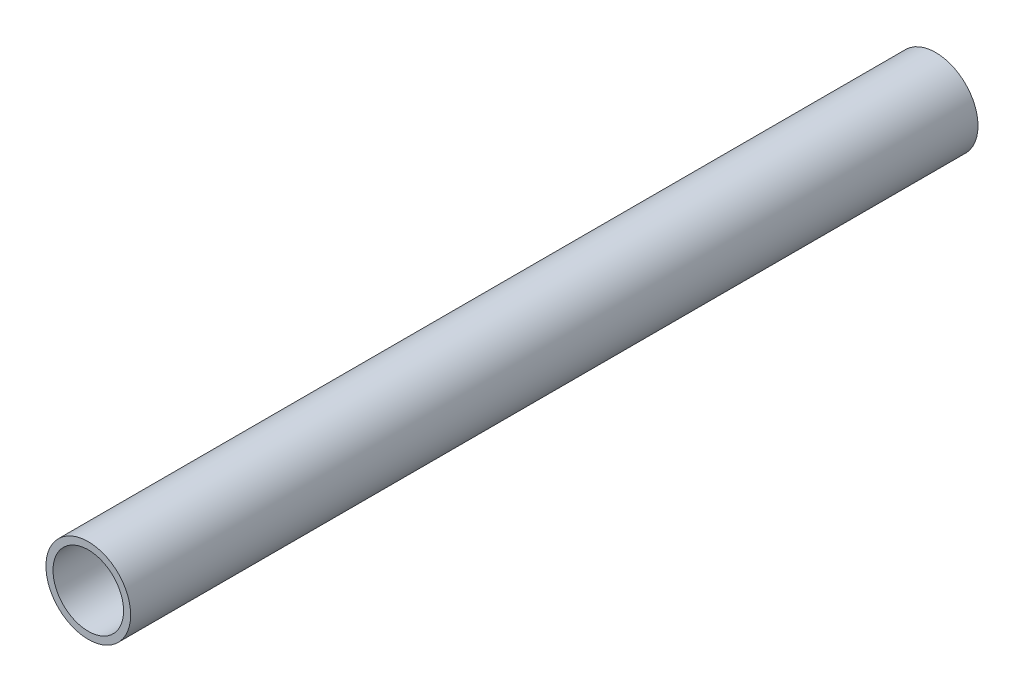
ISO-10303-21;
HEADER;
FILE_DESCRIPTION(('STEP AP214'),'2;1');
FILE_NAME('part.step','',(''),(''),'','','');
FILE_SCHEMA(('AUTOMOTIVE_DESIGN { 1 0 10303 214 1 1 1 1 }'));
ENDSEC;
DATA;
#1=APPLICATION_CONTEXT('core data for automotive mechanical design processes');
#2=APPLICATION_PROTOCOL_DEFINITION('international standard','automotive_design',2000,#1);
#3=PRODUCT_CONTEXT('',#1,'mechanical');
#4=PRODUCT('Part','Part','',(#3));
#5=PRODUCT_RELATED_PRODUCT_CATEGORY('part','',(#4));
#6=PRODUCT_DEFINITION_FORMATION('','',#4);
#7=PRODUCT_DEFINITION_CONTEXT('part definition',#1,'design');
#8=PRODUCT_DEFINITION('design','',#6,#7);
#9=PRODUCT_DEFINITION_SHAPE('','',#8);
#10=(LENGTH_UNIT() NAMED_UNIT(*) SI_UNIT(.MILLI.,.METRE.));
#11=(NAMED_UNIT(*) PLANE_ANGLE_UNIT() SI_UNIT($,.RADIAN.));
#12=(NAMED_UNIT(*) SI_UNIT($,.STERADIAN.) SOLID_ANGLE_UNIT());
#13=UNCERTAINTY_MEASURE_WITH_UNIT(LENGTH_MEASURE(1.E-05),#10,'distance_accuracy_value','');
#14=(GEOMETRIC_REPRESENTATION_CONTEXT(3) GLOBAL_UNCERTAINTY_ASSIGNED_CONTEXT((#13)) GLOBAL_UNIT_ASSIGNED_CONTEXT((#10,
#11,#12)) REPRESENTATION_CONTEXT('',''));
#15=CARTESIAN_POINT('',(0.,0.,0.));
#16=DIRECTION('',(0.,0.,1.));
#17=DIRECTION('',(1.,0.,0.));
#18=AXIS2_PLACEMENT_3D('',#15,#16,#17);
#19=CARTESIAN_POINT('',(0.,0.,300.));
#20=DIRECTION('',(0.,0.,1.));
#21=DIRECTION('',(1.,0.,0.));
#22=AXIS2_PLACEMENT_3D('',#19,#20,#21);
#23=PLANE('',#22);
#24=CARTESIAN_POINT('',(0.,0.,300.));
#25=DIRECTION('',(0.,0.,1.));
#26=DIRECTION('',(1.,0.,0.));
#27=AXIS2_PLACEMENT_3D('',#24,#25,#26);
#28=CIRCLE('',#27,15.);
#29=CARTESIAN_POINT('',(15.,0.,300.));
#30=VERTEX_POINT('',#29);
#31=EDGE_CURVE('E10',#30,#30,#28,.T.);
#32=ORIENTED_EDGE('',*,*,#31,.T.);
#33=EDGE_LOOP('',(#32));
#34=FACE_BOUND('',#33,.T.);
#35=CARTESIAN_POINT('',(0.,0.,300.));
#36=DIRECTION('',(0.,0.,1.));
#37=DIRECTION('',(1.,0.,0.));
#38=AXIS2_PLACEMENT_3D('',#35,#36,#37);
#39=CIRCLE('',#38,12.5);
#40=CARTESIAN_POINT('',(12.5,0.,300.));
#41=VERTEX_POINT('',#40);
#42=EDGE_CURVE('E50',#41,#41,#39,.T.);
#43=ORIENTED_EDGE('',*,*,#42,.F.);
#44=EDGE_LOOP('',(#43));
#45=FACE_BOUND('',#44,.T.);
#46=ADVANCED_FACE('F37',(#34,#45),#23,.T.);
#47=CARTESIAN_POINT('',(0.,0.,0.));
#48=DIRECTION('',(0.,0.,1.));
#49=DIRECTION('',(1.,0.,0.));
#50=AXIS2_PLACEMENT_3D('',#47,#48,#49);
#51=PLANE('',#50);
#52=CARTESIAN_POINT('',(0.,0.,0.));
#53=DIRECTION('',(0.,0.,1.));
#54=DIRECTION('',(1.,0.,0.));
#55=AXIS2_PLACEMENT_3D('',#52,#53,#54);
#56=CIRCLE('',#55,15.);
#57=CARTESIAN_POINT('',(15.,0.,0.));
#58=VERTEX_POINT('',#57);
#59=EDGE_CURVE('E41',#58,#58,#56,.T.);
#60=ORIENTED_EDGE('',*,*,#59,.F.);
#61=EDGE_LOOP('',(#60));
#62=FACE_BOUND('',#61,.T.);
#63=CARTESIAN_POINT('',(0.,0.,0.));
#64=DIRECTION('',(0.,0.,1.));
#65=DIRECTION('',(1.,0.,0.));
#66=AXIS2_PLACEMENT_3D('',#63,#64,#65);
#67=CIRCLE('',#66,12.5);
#68=CARTESIAN_POINT('',(12.5,0.,0.));
#69=VERTEX_POINT('',#68);
#70=EDGE_CURVE('E52',#69,#69,#67,.T.);
#71=ORIENTED_EDGE('',*,*,#70,.T.);
#72=EDGE_LOOP('',(#71));
#73=FACE_BOUND('',#72,.T.);
#74=ADVANCED_FACE('F64',(#62,#73),#51,.F.);
#75=CARTESIAN_POINT('',(0.,0.,300.));
#76=DIRECTION('',(0.,0.,-1.));
#77=DIRECTION('',(-1.,0.,0.));
#78=AXIS2_PLACEMENT_3D('',#75,#76,#77);
#79=CYLINDRICAL_SURFACE('',#78,15.);
#80=ORIENTED_EDGE('',*,*,#31,.F.);
#81=EDGE_LOOP('',(#80));
#82=FACE_BOUND('',#81,.T.);
#83=ORIENTED_EDGE('',*,*,#59,.T.);
#84=EDGE_LOOP('',(#83));
#85=FACE_BOUND('',#84,.T.);
#86=ADVANCED_FACE('F39',(#82,#85),#79,.T.);
#87=CARTESIAN_POINT('',(0.,0.,300.));
#88=DIRECTION('',(0.,0.,-1.));
#89=DIRECTION('',(-1.,0.,0.));
#90=AXIS2_PLACEMENT_3D('',#87,#88,#89);
#91=CYLINDRICAL_SURFACE('',#90,12.5);
#92=ORIENTED_EDGE('',*,*,#42,.T.);
#93=EDGE_LOOP('',(#92));
#94=FACE_BOUND('',#93,.T.);
#95=ORIENTED_EDGE('',*,*,#70,.F.);
#96=EDGE_LOOP('',(#95));
#97=FACE_BOUND('',#96,.T.);
#98=ADVANCED_FACE('F60',(#94,#97),#91,.F.);
#99=CLOSED_SHELL('',(#46,#74,#86,#98));
#100=MANIFOLD_SOLID_BREP('B2',#99);
#101=ADVANCED_BREP_SHAPE_REPRESENTATION('',(#18,#100),#14);
#102=SHAPE_DEFINITION_REPRESENTATION(#9,#101);
ENDSEC;
END-ISO-10303-21;
